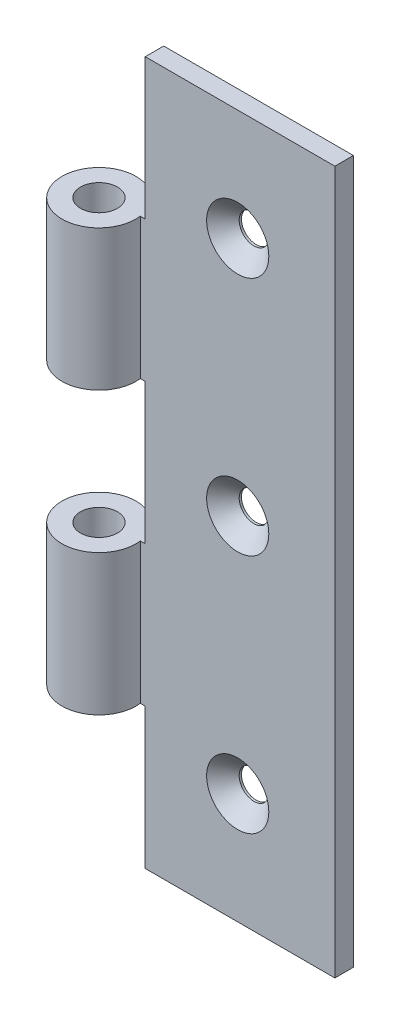
ISO-10303-21;
HEADER;
FILE_DESCRIPTION(('STEP AP214'),'2;1');
FILE_NAME('part.step','',(''),(''),'','','');
FILE_SCHEMA(('AUTOMOTIVE_DESIGN { 1 0 10303 214 1 1 1 1 }'));
ENDSEC;
DATA;
#1=APPLICATION_CONTEXT('core data for automotive mechanical design processes');
#2=APPLICATION_PROTOCOL_DEFINITION('international standard','automotive_design',2000,#1);
#3=PRODUCT_CONTEXT('',#1,'mechanical');
#4=PRODUCT('Part','Part','',(#3));
#5=PRODUCT_RELATED_PRODUCT_CATEGORY('part','',(#4));
#6=PRODUCT_DEFINITION_FORMATION('','',#4);
#7=PRODUCT_DEFINITION_CONTEXT('part definition',#1,'design');
#8=PRODUCT_DEFINITION('design','',#6,#7);
#9=PRODUCT_DEFINITION_SHAPE('','',#8);
#10=(LENGTH_UNIT() NAMED_UNIT(*) SI_UNIT(.MILLI.,.METRE.));
#11=(NAMED_UNIT(*) PLANE_ANGLE_UNIT() SI_UNIT($,.RADIAN.));
#12=(NAMED_UNIT(*) SI_UNIT($,.STERADIAN.) SOLID_ANGLE_UNIT());
#13=UNCERTAINTY_MEASURE_WITH_UNIT(LENGTH_MEASURE(1.E-05),#10,'distance_accuracy_value','');
#14=(GEOMETRIC_REPRESENTATION_CONTEXT(3) GLOBAL_UNCERTAINTY_ASSIGNED_CONTEXT((#13)) GLOBAL_UNIT_ASSIGNED_CONTEXT((#10,
#11,#12)) REPRESENTATION_CONTEXT('',''));
#15=CARTESIAN_POINT('',(0.,0.,0.));
#16=DIRECTION('',(0.,0.,1.));
#17=DIRECTION('',(1.,0.,0.));
#18=AXIS2_PLACEMENT_3D('',#15,#16,#17);
#19=CARTESIAN_POINT('',(14.0612494995996,76.,-2.5));
#20=DIRECTION('',(0.,0.,1.));
#21=DIRECTION('',(1.,0.,0.));
#22=AXIS2_PLACEMENT_3D('',#19,#20,#21);
#23=PLANE('',#22);
#24=CARTESIAN_POINT('',(14.5,12.,-2.5));
#25=DIRECTION('',(0.,0.,1.));
#26=DIRECTION('',(-1.,0.,0.));
#27=AXIS2_PLACEMENT_3D('',#24,#25,#26);
#28=CIRCLE('',#27,1.6);
#29=CARTESIAN_POINT('',(12.9,12.,-2.5));
#30=VERTEX_POINT('',#29);
#31=EDGE_CURVE('E11',#30,#30,#28,.T.);
#32=ORIENTED_EDGE('',*,*,#31,.T.);
#33=EDGE_LOOP('',(#32));
#34=FACE_BOUND('',#33,.T.);
#35=CARTESIAN_POINT('',(14.5,38.,-2.5));
#36=DIRECTION('',(0.,0.,1.));
#37=DIRECTION('',(-1.,0.,0.));
#38=AXIS2_PLACEMENT_3D('',#35,#36,#37);
#39=CIRCLE('',#38,1.6);
#40=CARTESIAN_POINT('',(12.9,38.,-2.5));
#41=VERTEX_POINT('',#40);
#42=EDGE_CURVE('E28',#41,#41,#39,.T.);
#43=ORIENTED_EDGE('',*,*,#42,.T.);
#44=EDGE_LOOP('',(#43));
#45=FACE_BOUND('',#44,.T.);
#46=CARTESIAN_POINT('',(14.5,64.,-2.5));
#47=DIRECTION('',(0.,0.,1.));
#48=DIRECTION('',(-1.,0.,0.));
#49=AXIS2_PLACEMENT_3D('',#46,#47,#48);
#50=CIRCLE('',#49,1.6);
#51=CARTESIAN_POINT('',(12.9,64.,-2.5));
#52=VERTEX_POINT('',#51);
#53=EDGE_CURVE('E244',#52,#52,#50,.T.);
#54=ORIENTED_EDGE('',*,*,#53,.T.);
#55=EDGE_LOOP('',(#54));
#56=FACE_BOUND('',#55,.T.);
#57=DIRECTION('',(1.,0.,0.));
#58=VECTOR('',#57,1.);
#59=CARTESIAN_POINT('',(14.0612494995996,15.2,-2.5));
#60=LINE('',#59,#58);
#61=CARTESIAN_POINT('',(3.12249899919921,15.2,-2.5));
#62=VERTEX_POINT('',#61);
#63=CARTESIAN_POINT('',(4.5,15.2,-2.5));
#64=VERTEX_POINT('',#63);
#65=EDGE_CURVE('E314',#62,#64,#60,.T.);
#66=ORIENTED_EDGE('',*,*,#65,.F.);
#67=DIRECTION('',(0.,-1.,0.));
#68=VECTOR('',#67,1.);
#69=CARTESIAN_POINT('',(3.1224989991992,76.,-2.5));
#70=LINE('',#69,#68);
#71=CARTESIAN_POINT('',(3.12249899919921,30.4,-2.5));
#72=VERTEX_POINT('',#71);
#73=EDGE_CURVE('E333',#72,#62,#70,.T.);
#74=ORIENTED_EDGE('',*,*,#73,.F.);
#75=DIRECTION('',(1.,0.,0.));
#76=VECTOR('',#75,1.);
#77=CARTESIAN_POINT('',(14.0612494995996,30.4,-2.5));
#78=LINE('',#77,#76);
#79=CARTESIAN_POINT('',(4.5,30.4,-2.5));
#80=VERTEX_POINT('',#79);
#81=EDGE_CURVE('E241',#72,#80,#78,.T.);
#82=ORIENTED_EDGE('',*,*,#81,.T.);
#83=DIRECTION('',(0.,-1.,0.));
#84=VECTOR('',#83,1.);
#85=CARTESIAN_POINT('',(4.5,76.,-2.5));
#86=LINE('',#85,#84);
#87=CARTESIAN_POINT('',(4.5,45.6,-2.5));
#88=VERTEX_POINT('',#87);
#89=EDGE_CURVE('E270',#88,#80,#86,.T.);
#90=ORIENTED_EDGE('',*,*,#89,.F.);
#91=DIRECTION('',(1.,0.,0.));
#92=VECTOR('',#91,1.);
#93=CARTESIAN_POINT('',(14.0612494995996,45.6,-2.5));
#94=LINE('',#93,#92);
#95=CARTESIAN_POINT('',(3.12249899919921,45.6,-2.5));
#96=VERTEX_POINT('',#95);
#97=EDGE_CURVE('E274',#96,#88,#94,.T.);
#98=ORIENTED_EDGE('',*,*,#97,.F.);
#99=DIRECTION('',(0.,-1.,0.));
#100=VECTOR('',#99,1.);
#101=CARTESIAN_POINT('',(3.1224989991992,76.,-2.5));
#102=LINE('',#101,#100);
#103=CARTESIAN_POINT('',(3.12249899919921,60.8,-2.5));
#104=VERTEX_POINT('',#103);
#105=EDGE_CURVE('E343',#104,#96,#102,.T.);
#106=ORIENTED_EDGE('',*,*,#105,.F.);
#107=DIRECTION('',(1.,0.,0.));
#108=VECTOR('',#107,1.);
#109=CARTESIAN_POINT('',(14.0612494995996,60.8,-2.5));
#110=LINE('',#109,#108);
#111=CARTESIAN_POINT('',(4.5,60.8,-2.5));
#112=VERTEX_POINT('',#111);
#113=EDGE_CURVE('E245',#104,#112,#110,.T.);
#114=ORIENTED_EDGE('',*,*,#113,.T.);
#115=DIRECTION('',(0.,-1.,0.));
#116=VECTOR('',#115,1.);
#117=CARTESIAN_POINT('',(4.5,76.,-2.5));
#118=LINE('',#117,#116);
#119=CARTESIAN_POINT('',(4.5,76.,-2.5));
#120=VERTEX_POINT('',#119);
#121=EDGE_CURVE('E265',#120,#112,#118,.T.);
#122=ORIENTED_EDGE('',*,*,#121,.F.);
#123=DIRECTION('',(1.,0.,0.));
#124=VECTOR('',#123,1.);
#125=CARTESIAN_POINT('',(14.0612494995996,76.,-2.5));
#126=LINE('',#125,#124);
#127=CARTESIAN_POINT('',(25.,76.,-2.5));
#128=VERTEX_POINT('',#127);
#129=EDGE_CURVE('E249',#120,#128,#126,.T.);
#130=ORIENTED_EDGE('',*,*,#129,.T.);
#131=DIRECTION('',(0.,-1.,0.));
#132=VECTOR('',#131,1.);
#133=CARTESIAN_POINT('',(25.,76.,-2.5));
#134=LINE('',#133,#132);
#135=CARTESIAN_POINT('',(25.,0.,-2.5));
#136=VERTEX_POINT('',#135);
#137=EDGE_CURVE('E227',#128,#136,#134,.T.);
#138=ORIENTED_EDGE('',*,*,#137,.T.);
#139=DIRECTION('',(1.,0.,0.));
#140=VECTOR('',#139,1.);
#141=CARTESIAN_POINT('',(14.0612494995996,0.,-2.5));
#142=LINE('',#141,#140);
#143=CARTESIAN_POINT('',(4.5,0.,-2.5));
#144=VERTEX_POINT('',#143);
#145=EDGE_CURVE('E230',#144,#136,#142,.T.);
#146=ORIENTED_EDGE('',*,*,#145,.F.);
#147=DIRECTION('',(0.,-1.,0.));
#148=VECTOR('',#147,1.);
#149=CARTESIAN_POINT('',(4.5,76.,-2.5));
#150=LINE('',#149,#148);
#151=EDGE_CURVE('E347',#64,#144,#150,.T.);
#152=ORIENTED_EDGE('',*,*,#151,.F.);
#153=EDGE_LOOP('',(#66,#74,#82,#90,#98,#106,#114,#122,#130,#138,#146,#152));
#154=FACE_BOUND('',#153,.T.);
#155=ADVANCED_FACE('F17',(#34,#45,#56,#154),#23,.F.);
#156=CARTESIAN_POINT('',(0.,76.,0.));
#157=DIRECTION('',(0.,-1.,0.));
#158=DIRECTION('',(0.,0.,-1.));
#159=AXIS2_PLACEMENT_3D('',#156,#157,#158);
#160=CYLINDRICAL_SURFACE('',#159,4.);
#161=ORIENTED_EDGE('',*,*,#73,.T.);
#162=CARTESIAN_POINT('',(0.,15.2,0.));
#163=DIRECTION('',(0.,1.,0.));
#164=DIRECTION('',(0.,0.,-1.));
#165=AXIS2_PLACEMENT_3D('',#162,#163,#164);
#166=CIRCLE('',#165,4.);
#167=CARTESIAN_POINT('',(3.96862696659689,15.2,-0.5));
#168=VERTEX_POINT('',#167);
#169=EDGE_CURVE('E340',#62,#168,#166,.T.);
#170=ORIENTED_EDGE('',*,*,#169,.T.);
#171=DIRECTION('',(0.,-1.,0.));
#172=VECTOR('',#171,1.);
#173=CARTESIAN_POINT('',(3.96862696659689,76.,-0.5));
#174=LINE('',#173,#172);
#175=CARTESIAN_POINT('',(3.96862696659689,30.4,-0.5));
#176=VERTEX_POINT('',#175);
#177=EDGE_CURVE('E281',#176,#168,#174,.T.);
#178=ORIENTED_EDGE('',*,*,#177,.F.);
#179=CARTESIAN_POINT('',(0.,30.4,0.));
#180=DIRECTION('',(0.,1.,0.));
#181=DIRECTION('',(0.,0.,-1.));
#182=AXIS2_PLACEMENT_3D('',#179,#180,#181);
#183=CIRCLE('',#182,4.);
#184=EDGE_CURVE('E296',#72,#176,#183,.T.);
#185=ORIENTED_EDGE('',*,*,#184,.F.);
#186=EDGE_LOOP('',(#161,#170,#178,#185));
#187=FACE_BOUND('',#186,.T.);
#188=ADVANCED_FACE('F382',(#187),#160,.T.);
#189=CARTESIAN_POINT('',(0.,76.,0.));
#190=DIRECTION('',(0.,-1.,0.));
#191=DIRECTION('',(0.,0.,-1.));
#192=AXIS2_PLACEMENT_3D('',#189,#190,#191);
#193=CYLINDRICAL_SURFACE('',#192,4.);
#194=ORIENTED_EDGE('',*,*,#105,.T.);
#195=CARTESIAN_POINT('',(0.,45.6,0.));
#196=DIRECTION('',(0.,1.,0.));
#197=DIRECTION('',(0.,0.,-1.));
#198=AXIS2_PLACEMENT_3D('',#195,#196,#197);
#199=CIRCLE('',#198,4.);
#200=CARTESIAN_POINT('',(3.96862696659689,45.6,-0.5));
#201=VERTEX_POINT('',#200);
#202=EDGE_CURVE('E284',#96,#201,#199,.T.);
#203=ORIENTED_EDGE('',*,*,#202,.T.);
#204=DIRECTION('',(0.,-1.,0.));
#205=VECTOR('',#204,1.);
#206=CARTESIAN_POINT('',(3.96862696659689,76.,-0.5));
#207=LINE('',#206,#205);
#208=CARTESIAN_POINT('',(3.96862696659689,60.8,-0.5));
#209=VERTEX_POINT('',#208);
#210=EDGE_CURVE('E239',#209,#201,#207,.T.);
#211=ORIENTED_EDGE('',*,*,#210,.F.);
#212=CARTESIAN_POINT('',(0.,60.8,0.));
#213=DIRECTION('',(0.,1.,0.));
#214=DIRECTION('',(0.,0.,-1.));
#215=AXIS2_PLACEMENT_3D('',#212,#213,#214);
#216=CIRCLE('',#215,4.);
#217=EDGE_CURVE('E264',#104,#209,#216,.T.);
#218=ORIENTED_EDGE('',*,*,#217,.F.);
#219=EDGE_LOOP('',(#194,#203,#211,#218));
#220=FACE_BOUND('',#219,.T.);
#221=ADVANCED_FACE('F419',(#220),#193,.T.);
#222=CARTESIAN_POINT('',(14.4843134832984,76.,-0.5));
#223=DIRECTION('',(0.,0.,1.));
#224=DIRECTION('',(1.,0.,0.));
#225=AXIS2_PLACEMENT_3D('',#222,#223,#224);
#226=PLANE('',#225);
#227=CARTESIAN_POINT('',(14.5,64.,-0.5));
#228=DIRECTION('',(0.,0.,1.));
#229=DIRECTION('',(1.,0.,0.));
#230=AXIS2_PLACEMENT_3D('',#227,#228,#229);
#231=CIRCLE('',#230,3.36);
#232=CARTESIAN_POINT('',(17.86,64.,-0.5));
#233=VERTEX_POINT('',#232);
#234=EDGE_CURVE('E290',#233,#233,#231,.T.);
#235=ORIENTED_EDGE('',*,*,#234,.F.);
#236=EDGE_LOOP('',(#235));
#237=FACE_BOUND('',#236,.T.);
#238=CARTESIAN_POINT('',(14.5,38.,-0.5));
#239=DIRECTION('',(0.,0.,1.));
#240=DIRECTION('',(1.,0.,0.));
#241=AXIS2_PLACEMENT_3D('',#238,#239,#240);
#242=CIRCLE('',#241,3.36);
#243=CARTESIAN_POINT('',(17.86,38.,-0.5));
#244=VERTEX_POINT('',#243);
#245=EDGE_CURVE('E279',#244,#244,#242,.T.);
#246=ORIENTED_EDGE('',*,*,#245,.F.);
#247=EDGE_LOOP('',(#246));
#248=FACE_BOUND('',#247,.T.);
#249=CARTESIAN_POINT('',(14.5,12.,-0.5));
#250=DIRECTION('',(0.,0.,1.));
#251=DIRECTION('',(1.,0.,0.));
#252=AXIS2_PLACEMENT_3D('',#249,#250,#251);
#253=CIRCLE('',#252,3.36);
#254=CARTESIAN_POINT('',(17.86,12.,-0.5));
#255=VERTEX_POINT('',#254);
#256=EDGE_CURVE('E250',#255,#255,#253,.T.);
#257=ORIENTED_EDGE('',*,*,#256,.F.);
#258=EDGE_LOOP('',(#257));
#259=FACE_BOUND('',#258,.T.);
#260=ORIENTED_EDGE('',*,*,#177,.T.);
#261=DIRECTION('',(1.,0.,0.));
#262=VECTOR('',#261,1.);
#263=CARTESIAN_POINT('',(14.4843134832984,15.2,-0.5));
#264=LINE('',#263,#262);
#265=CARTESIAN_POINT('',(4.5,15.2,-0.5));
#266=VERTEX_POINT('',#265);
#267=EDGE_CURVE('E285',#168,#266,#264,.T.);
#268=ORIENTED_EDGE('',*,*,#267,.T.);
#269=DIRECTION('',(0.,-1.,0.));
#270=VECTOR('',#269,1.);
#271=CARTESIAN_POINT('',(4.5,76.,-0.5));
#272=LINE('',#271,#270);
#273=CARTESIAN_POINT('',(4.5,0.,-0.5));
#274=VERTEX_POINT('',#273);
#275=EDGE_CURVE('E334',#266,#274,#272,.T.);
#276=ORIENTED_EDGE('',*,*,#275,.T.);
#277=DIRECTION('',(1.,0.,0.));
#278=VECTOR('',#277,1.);
#279=CARTESIAN_POINT('',(14.4843134832984,0.,-0.5));
#280=LINE('',#279,#278);
#281=CARTESIAN_POINT('',(25.,0.,-0.5));
#282=VERTEX_POINT('',#281);
#283=EDGE_CURVE('E218',#274,#282,#280,.T.);
#284=ORIENTED_EDGE('',*,*,#283,.T.);
#285=DIRECTION('',(0.,-1.,0.));
#286=VECTOR('',#285,1.);
#287=CARTESIAN_POINT('',(25.,76.,-0.5));
#288=LINE('',#287,#286);
#289=CARTESIAN_POINT('',(25.,76.,-0.5));
#290=VERTEX_POINT('',#289);
#291=EDGE_CURVE('E214',#290,#282,#288,.T.);
#292=ORIENTED_EDGE('',*,*,#291,.F.);
#293=DIRECTION('',(1.,0.,0.));
#294=VECTOR('',#293,1.);
#295=CARTESIAN_POINT('',(14.4843134832984,76.,-0.5));
#296=LINE('',#295,#294);
#297=CARTESIAN_POINT('',(4.5,76.,-0.5));
#298=VERTEX_POINT('',#297);
#299=EDGE_CURVE('E201',#298,#290,#296,.T.);
#300=ORIENTED_EDGE('',*,*,#299,.F.);
#301=DIRECTION('',(0.,-1.,0.));
#302=VECTOR('',#301,1.);
#303=CARTESIAN_POINT('',(4.5,76.,-0.5));
#304=LINE('',#303,#302);
#305=CARTESIAN_POINT('',(4.5,60.8,-0.5));
#306=VERTEX_POINT('',#305);
#307=EDGE_CURVE('E254',#298,#306,#304,.T.);
#308=ORIENTED_EDGE('',*,*,#307,.T.);
#309=DIRECTION('',(1.,0.,0.));
#310=VECTOR('',#309,1.);
#311=CARTESIAN_POINT('',(14.4843134832984,60.8,-0.5));
#312=LINE('',#311,#310);
#313=EDGE_CURVE('E92',#209,#306,#312,.T.);
#314=ORIENTED_EDGE('',*,*,#313,.F.);
#315=ORIENTED_EDGE('',*,*,#210,.T.);
#316=DIRECTION('',(1.,0.,0.));
#317=VECTOR('',#316,1.);
#318=CARTESIAN_POINT('',(14.4843134832984,45.6,-0.5));
#319=LINE('',#318,#317);
#320=CARTESIAN_POINT('',(4.5,45.6,-0.5));
#321=VERTEX_POINT('',#320);
#322=EDGE_CURVE('E273',#201,#321,#319,.T.);
#323=ORIENTED_EDGE('',*,*,#322,.T.);
#324=DIRECTION('',(0.,-1.,0.));
#325=VECTOR('',#324,1.);
#326=CARTESIAN_POINT('',(4.5,76.,-0.5));
#327=LINE('',#326,#325);
#328=CARTESIAN_POINT('',(4.5,30.4,-0.5));
#329=VERTEX_POINT('',#328);
#330=EDGE_CURVE('E109',#321,#329,#327,.T.);
#331=ORIENTED_EDGE('',*,*,#330,.T.);
#332=DIRECTION('',(1.,0.,0.));
#333=VECTOR('',#332,1.);
#334=CARTESIAN_POINT('',(14.4843134832984,30.4,-0.5));
#335=LINE('',#334,#333);
#336=EDGE_CURVE('E320',#176,#329,#335,.T.);
#337=ORIENTED_EDGE('',*,*,#336,.F.);
#338=EDGE_LOOP('',(#260,#268,#276,#284,#292,#300,#308,#314,#315,#323,#331,#337));
#339=FACE_BOUND('',#338,.T.);
#340=ADVANCED_FACE('F216',(#237,#248,#259,#339),#226,.T.);
#341=CARTESIAN_POINT('',(25.,76.,-1.5));
#342=DIRECTION('',(1.,0.,0.));
#343=DIRECTION('',(0.,1.,0.));
#344=AXIS2_PLACEMENT_3D('',#341,#342,#343);
#345=PLANE('',#344);
#346=DIRECTION('',(0.,0.,-1.));
#347=VECTOR('',#346,1.);
#348=CARTESIAN_POINT('',(25.,0.,-1.5));
#349=LINE('',#348,#347);
#350=EDGE_CURVE('E223',#282,#136,#349,.T.);
#351=ORIENTED_EDGE('',*,*,#350,.T.);
#352=ORIENTED_EDGE('',*,*,#137,.F.);
#353=DIRECTION('',(0.,0.,-1.));
#354=VECTOR('',#353,1.);
#355=CARTESIAN_POINT('',(25.,76.,-1.5));
#356=LINE('',#355,#354);
#357=EDGE_CURVE('E206',#290,#128,#356,.T.);
#358=ORIENTED_EDGE('',*,*,#357,.F.);
#359=ORIENTED_EDGE('',*,*,#291,.T.);
#360=EDGE_LOOP('',(#351,#352,#358,#359));
#361=FACE_BOUND('',#360,.T.);
#362=ADVANCED_FACE('F225',(#361),#345,.T.);
#363=CARTESIAN_POINT('',(10.5,76.,0.));
#364=DIRECTION('',(0.,-1.,0.));
#365=DIRECTION('',(0.,0.,-1.));
#366=AXIS2_PLACEMENT_3D('',#363,#364,#365);
#367=PLANE('',#366);
#368=ORIENTED_EDGE('',*,*,#129,.F.);
#369=DIRECTION('',(0.,0.,1.));
#370=VECTOR('',#369,1.);
#371=CARTESIAN_POINT('',(4.5,76.,-91.333600454647));
#372=LINE('',#371,#370);
#373=EDGE_CURVE('E208',#120,#298,#372,.T.);
#374=ORIENTED_EDGE('',*,*,#373,.T.);
#375=ORIENTED_EDGE('',*,*,#299,.T.);
#376=ORIENTED_EDGE('',*,*,#357,.T.);
#377=EDGE_LOOP('',(#368,#374,#375,#376));
#378=FACE_BOUND('',#377,.T.);
#379=ADVANCED_FACE('F204',(#378),#367,.F.);
#380=CARTESIAN_POINT('',(10.5,0.,0.));
#381=DIRECTION('',(0.,-1.,0.));
#382=DIRECTION('',(0.,0.,-1.));
#383=AXIS2_PLACEMENT_3D('',#380,#381,#382);
#384=PLANE('',#383);
#385=DIRECTION('',(0.,0.,1.));
#386=VECTOR('',#385,1.);
#387=CARTESIAN_POINT('',(4.5,0.,-91.333600454647));
#388=LINE('',#387,#386);
#389=EDGE_CURVE('E261',#144,#274,#388,.T.);
#390=ORIENTED_EDGE('',*,*,#389,.F.);
#391=ORIENTED_EDGE('',*,*,#145,.T.);
#392=ORIENTED_EDGE('',*,*,#350,.F.);
#393=ORIENTED_EDGE('',*,*,#283,.F.);
#394=EDGE_LOOP('',(#390,#391,#392,#393));
#395=FACE_BOUND('',#394,.T.);
#396=ADVANCED_FACE('F432',(#395),#384,.T.);
#397=CARTESIAN_POINT('',(14.5,12.,-0.5));
#398=DIRECTION('',(0.,0.,-1.));
#399=DIRECTION('',(1.,0.,0.));
#400=AXIS2_PLACEMENT_3D('',#397,#398,#399);
#401=CYLINDRICAL_SURFACE('',#400,1.6);
#402=CARTESIAN_POINT('',(14.5,12.,-2.26));
#403=DIRECTION('',(0.,0.,1.));
#404=DIRECTION('',(1.,0.,0.));
#405=AXIS2_PLACEMENT_3D('',#402,#403,#404);
#406=CIRCLE('',#405,1.6);
#407=CARTESIAN_POINT('',(16.1,12.,-2.26));
#408=VERTEX_POINT('',#407);
#409=EDGE_CURVE('E122',#408,#408,#406,.T.);
#410=ORIENTED_EDGE('',*,*,#409,.T.);
#411=EDGE_LOOP('',(#410));
#412=FACE_BOUND('',#411,.T.);
#413=ORIENTED_EDGE('',*,*,#31,.F.);
#414=EDGE_LOOP('',(#413));
#415=FACE_BOUND('',#414,.T.);
#416=ADVANCED_FACE('F410',(#412,#415),#401,.F.);
#417=CARTESIAN_POINT('',(14.5,12.,-0.5));
#418=DIRECTION('',(0.,0.,1.));
#419=DIRECTION('',(-1.,0.,0.));
#420=AXIS2_PLACEMENT_3D('',#417,#418,#419);
#421=CONICAL_SURFACE('',#420,3.36,0.785398163397448);
#422=ORIENTED_EDGE('',*,*,#409,.F.);
#423=EDGE_LOOP('',(#422));
#424=FACE_BOUND('',#423,.T.);
#425=ORIENTED_EDGE('',*,*,#256,.T.);
#426=EDGE_LOOP('',(#425));
#427=FACE_BOUND('',#426,.T.);
#428=ADVANCED_FACE('F401',(#424,#427),#421,.F.);
#429=CARTESIAN_POINT('',(14.5,38.,-0.5));
#430=DIRECTION('',(0.,0.,-1.));
#431=DIRECTION('',(1.,0.,0.));
#432=AXIS2_PLACEMENT_3D('',#429,#430,#431);
#433=CYLINDRICAL_SURFACE('',#432,1.6);
#434=CARTESIAN_POINT('',(14.5,38.,-2.26));
#435=DIRECTION('',(0.,0.,1.));
#436=DIRECTION('',(1.,0.,0.));
#437=AXIS2_PLACEMENT_3D('',#434,#435,#436);
#438=CIRCLE('',#437,1.6);
#439=CARTESIAN_POINT('',(16.1,38.,-2.26));
#440=VERTEX_POINT('',#439);
#441=EDGE_CURVE('E132',#440,#440,#438,.T.);
#442=ORIENTED_EDGE('',*,*,#441,.T.);
#443=EDGE_LOOP('',(#442));
#444=FACE_BOUND('',#443,.T.);
#445=ORIENTED_EDGE('',*,*,#42,.F.);
#446=EDGE_LOOP('',(#445));
#447=FACE_BOUND('',#446,.T.);
#448=ADVANCED_FACE('F398',(#444,#447),#433,.F.);
#449=CARTESIAN_POINT('',(14.5,38.,-0.5));
#450=DIRECTION('',(0.,0.,1.));
#451=DIRECTION('',(-1.,0.,0.));
#452=AXIS2_PLACEMENT_3D('',#449,#450,#451);
#453=CONICAL_SURFACE('',#452,3.36,0.785398163397448);
#454=ORIENTED_EDGE('',*,*,#441,.F.);
#455=EDGE_LOOP('',(#454));
#456=FACE_BOUND('',#455,.T.);
#457=ORIENTED_EDGE('',*,*,#245,.T.);
#458=EDGE_LOOP('',(#457));
#459=FACE_BOUND('',#458,.T.);
#460=ADVANCED_FACE('F400',(#456,#459),#453,.F.);
#461=CARTESIAN_POINT('',(14.5,64.,-0.5));
#462=DIRECTION('',(0.,0.,-1.));
#463=DIRECTION('',(1.,0.,0.));
#464=AXIS2_PLACEMENT_3D('',#461,#462,#463);
#465=CYLINDRICAL_SURFACE('',#464,1.6);
#466=CARTESIAN_POINT('',(14.5,64.,-2.26));
#467=DIRECTION('',(0.,0.,1.));
#468=DIRECTION('',(1.,0.,0.));
#469=AXIS2_PLACEMENT_3D('',#466,#467,#468);
#470=CIRCLE('',#469,1.6);
#471=CARTESIAN_POINT('',(16.1,64.,-2.26));
#472=VERTEX_POINT('',#471);
#473=EDGE_CURVE('E286',#472,#472,#470,.T.);
#474=ORIENTED_EDGE('',*,*,#473,.T.);
#475=EDGE_LOOP('',(#474));
#476=FACE_BOUND('',#475,.T.);
#477=ORIENTED_EDGE('',*,*,#53,.F.);
#478=EDGE_LOOP('',(#477));
#479=FACE_BOUND('',#478,.T.);
#480=ADVANCED_FACE('F19',(#476,#479),#465,.F.);
#481=CARTESIAN_POINT('',(14.5,64.,-0.5));
#482=DIRECTION('',(0.,0.,1.));
#483=DIRECTION('',(-1.,0.,0.));
#484=AXIS2_PLACEMENT_3D('',#481,#482,#483);
#485=CONICAL_SURFACE('',#484,3.36,0.785398163397448);
#486=ORIENTED_EDGE('',*,*,#473,.F.);
#487=EDGE_LOOP('',(#486));
#488=FACE_BOUND('',#487,.T.);
#489=ORIENTED_EDGE('',*,*,#234,.T.);
#490=EDGE_LOOP('',(#489));
#491=FACE_BOUND('',#490,.T.);
#492=ADVANCED_FACE('F433',(#488,#491),#485,.F.);
#493=CARTESIAN_POINT('',(0.,60.8,-91.333600454647));
#494=DIRECTION('',(0.,-1.,0.));
#495=DIRECTION('',(0.,0.,-1.));
#496=AXIS2_PLACEMENT_3D('',#493,#494,#495);
#497=PLANE('',#496);
#498=CARTESIAN_POINT('',(0.,60.8,0.));
#499=DIRECTION('',(0.,1.,0.));
#500=DIRECTION('',(0.,0.,-1.));
#501=AXIS2_PLACEMENT_3D('',#498,#499,#500);
#502=CIRCLE('',#501,2.);
#503=CARTESIAN_POINT('',(0.,60.8,-2.));
#504=VERTEX_POINT('',#503);
#505=EDGE_CURVE('E257',#504,#504,#502,.T.);
#506=ORIENTED_EDGE('',*,*,#505,.F.);
#507=EDGE_LOOP('',(#506));
#508=FACE_BOUND('',#507,.T.);
#509=ORIENTED_EDGE('',*,*,#217,.T.);
#510=ORIENTED_EDGE('',*,*,#313,.T.);
#511=DIRECTION('',(0.,0.,1.));
#512=VECTOR('',#511,1.);
#513=CARTESIAN_POINT('',(4.5,60.8,-91.333600454647));
#514=LINE('',#513,#512);
#515=EDGE_CURVE('E266',#112,#306,#514,.T.);
#516=ORIENTED_EDGE('',*,*,#515,.F.);
#517=ORIENTED_EDGE('',*,*,#113,.F.);
#518=EDGE_LOOP('',(#509,#510,#516,#517));
#519=FACE_BOUND('',#518,.T.);
#520=ADVANCED_FACE('F436',(#508,#519),#497,.F.);
#521=CARTESIAN_POINT('',(4.5,68.4,-91.333600454647));
#522=DIRECTION('',(-1.,0.,0.));
#523=DIRECTION('',(0.,1.,0.));
#524=AXIS2_PLACEMENT_3D('',#521,#522,#523);
#525=PLANE('',#524);
#526=ORIENTED_EDGE('',*,*,#121,.T.);
#527=ORIENTED_EDGE('',*,*,#515,.T.);
#528=ORIENTED_EDGE('',*,*,#307,.F.);
#529=ORIENTED_EDGE('',*,*,#373,.F.);
#530=EDGE_LOOP('',(#526,#527,#528,#529));
#531=FACE_BOUND('',#530,.T.);
#532=ADVANCED_FACE('F438',(#531),#525,.T.);
#533=CARTESIAN_POINT('',(4.5,38.,-91.333600454647));
#534=DIRECTION('',(-1.,0.,0.));
#535=DIRECTION('',(0.,1.,0.));
#536=AXIS2_PLACEMENT_3D('',#533,#534,#535);
#537=PLANE('',#536);
#538=ORIENTED_EDGE('',*,*,#89,.T.);
#539=DIRECTION('',(0.,0.,1.));
#540=VECTOR('',#539,1.);
#541=CARTESIAN_POINT('',(4.5,30.4,-91.333600454647));
#542=LINE('',#541,#540);
#543=EDGE_CURVE('E293',#80,#329,#542,.T.);
#544=ORIENTED_EDGE('',*,*,#543,.T.);
#545=ORIENTED_EDGE('',*,*,#330,.F.);
#546=DIRECTION('',(0.,0.,1.));
#547=VECTOR('',#546,1.);
#548=CARTESIAN_POINT('',(4.5,45.6,-91.333600454647));
#549=LINE('',#548,#547);
#550=EDGE_CURVE('E277',#88,#321,#549,.T.);
#551=ORIENTED_EDGE('',*,*,#550,.F.);
#552=EDGE_LOOP('',(#538,#544,#545,#551));
#553=FACE_BOUND('',#552,.T.);
#554=ADVANCED_FACE('F441',(#553),#537,.T.);
#555=CARTESIAN_POINT('',(0.,30.4,-91.333600454647));
#556=DIRECTION('',(0.,-1.,0.));
#557=DIRECTION('',(0.,0.,-1.));
#558=AXIS2_PLACEMENT_3D('',#555,#556,#557);
#559=PLANE('',#558);
#560=CARTESIAN_POINT('',(0.,30.4,0.));
#561=DIRECTION('',(0.,1.,0.));
#562=DIRECTION('',(0.,0.,-1.));
#563=AXIS2_PLACEMENT_3D('',#560,#561,#562);
#564=CIRCLE('',#563,2.);
#565=CARTESIAN_POINT('',(0.,30.4,-2.));
#566=VERTEX_POINT('',#565);
#567=EDGE_CURVE('E299',#566,#566,#564,.T.);
#568=ORIENTED_EDGE('',*,*,#567,.F.);
#569=EDGE_LOOP('',(#568));
#570=FACE_BOUND('',#569,.T.);
#571=ORIENTED_EDGE('',*,*,#184,.T.);
#572=ORIENTED_EDGE('',*,*,#336,.T.);
#573=ORIENTED_EDGE('',*,*,#543,.F.);
#574=ORIENTED_EDGE('',*,*,#81,.F.);
#575=EDGE_LOOP('',(#571,#572,#573,#574));
#576=FACE_BOUND('',#575,.T.);
#577=ADVANCED_FACE('F448',(#570,#576),#559,.F.);
#578=CARTESIAN_POINT('',(0.,45.6,-91.333600454647));
#579=DIRECTION('',(0.,-1.,0.));
#580=DIRECTION('',(0.,0.,-1.));
#581=AXIS2_PLACEMENT_3D('',#578,#579,#580);
#582=PLANE('',#581);
#583=CARTESIAN_POINT('',(0.,45.6,0.));
#584=DIRECTION('',(0.,1.,0.));
#585=DIRECTION('',(0.,0.,-1.));
#586=AXIS2_PLACEMENT_3D('',#583,#584,#585);
#587=CIRCLE('',#586,2.);
#588=CARTESIAN_POINT('',(0.,45.6,-2.));
#589=VERTEX_POINT('',#588);
#590=EDGE_CURVE('E21',#589,#589,#587,.T.);
#591=ORIENTED_EDGE('',*,*,#590,.T.);
#592=EDGE_LOOP('',(#591));
#593=FACE_BOUND('',#592,.T.);
#594=ORIENTED_EDGE('',*,*,#97,.T.);
#595=ORIENTED_EDGE('',*,*,#550,.T.);
#596=ORIENTED_EDGE('',*,*,#322,.F.);
#597=ORIENTED_EDGE('',*,*,#202,.F.);
#598=EDGE_LOOP('',(#594,#595,#596,#597));
#599=FACE_BOUND('',#598,.T.);
#600=ADVANCED_FACE('F449',(#593,#599),#582,.T.);
#601=CARTESIAN_POINT('',(0.,76.,0.));
#602=DIRECTION('',(0.,-1.,0.));
#603=DIRECTION('',(0.,0.,-1.));
#604=AXIS2_PLACEMENT_3D('',#601,#602,#603);
#605=CYLINDRICAL_SURFACE('',#604,2.);
#606=ORIENTED_EDGE('',*,*,#567,.T.);
#607=EDGE_LOOP('',(#606));
#608=FACE_BOUND('',#607,.T.);
#609=CARTESIAN_POINT('',(0.,15.2,0.));
#610=DIRECTION('',(0.,1.,0.));
#611=DIRECTION('',(0.,0.,-1.));
#612=AXIS2_PLACEMENT_3D('',#609,#610,#611);
#613=CIRCLE('',#612,2.);
#614=CARTESIAN_POINT('',(0.,15.2,-2.));
#615=VERTEX_POINT('',#614);
#616=EDGE_CURVE('E317',#615,#615,#613,.T.);
#617=ORIENTED_EDGE('',*,*,#616,.F.);
#618=EDGE_LOOP('',(#617));
#619=FACE_BOUND('',#618,.T.);
#620=ADVANCED_FACE('F452',(#608,#619),#605,.F.);
#621=CARTESIAN_POINT('',(0.,15.2,-91.333600454647));
#622=DIRECTION('',(0.,-1.,0.));
#623=DIRECTION('',(0.,0.,-1.));
#624=AXIS2_PLACEMENT_3D('',#621,#622,#623);
#625=PLANE('',#624);
#626=ORIENTED_EDGE('',*,*,#616,.T.);
#627=EDGE_LOOP('',(#626));
#628=FACE_BOUND('',#627,.T.);
#629=ORIENTED_EDGE('',*,*,#65,.T.);
#630=DIRECTION('',(0.,0.,1.));
#631=VECTOR('',#630,1.);
#632=CARTESIAN_POINT('',(4.5,15.2,-91.333600454647));
#633=LINE('',#632,#631);
#634=EDGE_CURVE('E318',#64,#266,#633,.T.);
#635=ORIENTED_EDGE('',*,*,#634,.T.);
#636=ORIENTED_EDGE('',*,*,#267,.F.);
#637=ORIENTED_EDGE('',*,*,#169,.F.);
#638=EDGE_LOOP('',(#629,#635,#636,#637));
#639=FACE_BOUND('',#638,.T.);
#640=ADVANCED_FACE('F387',(#628,#639),#625,.T.);
#641=CARTESIAN_POINT('',(4.5,7.6,-91.333600454647));
#642=DIRECTION('',(-1.,0.,0.));
#643=DIRECTION('',(0.,1.,0.));
#644=AXIS2_PLACEMENT_3D('',#641,#642,#643);
#645=PLANE('',#644);
#646=ORIENTED_EDGE('',*,*,#151,.T.);
#647=ORIENTED_EDGE('',*,*,#389,.T.);
#648=ORIENTED_EDGE('',*,*,#275,.F.);
#649=ORIENTED_EDGE('',*,*,#634,.F.);
#650=EDGE_LOOP('',(#646,#647,#648,#649));
#651=FACE_BOUND('',#650,.T.);
#652=ADVANCED_FACE('F425',(#651),#645,.T.);
#653=CARTESIAN_POINT('',(0.,76.,0.));
#654=DIRECTION('',(0.,-1.,0.));
#655=DIRECTION('',(0.,0.,-1.));
#656=AXIS2_PLACEMENT_3D('',#653,#654,#655);
#657=CYLINDRICAL_SURFACE('',#656,2.);
#658=ORIENTED_EDGE('',*,*,#505,.T.);
#659=EDGE_LOOP('',(#658));
#660=FACE_BOUND('',#659,.T.);
#661=ORIENTED_EDGE('',*,*,#590,.F.);
#662=EDGE_LOOP('',(#661));
#663=FACE_BOUND('',#662,.T.);
#664=ADVANCED_FACE('F428',(#660,#663),#657,.F.);
#665=CLOSED_SHELL('',(#155,#188,#221,#340,#362,#379,#396,#416,#428,#448,#460,#480,#492,#520,
#532,#554,#577,#600,#620,#640,#652,#664));
#666=MANIFOLD_SOLID_BREP('B1',#665);
#667=ADVANCED_BREP_SHAPE_REPRESENTATION('',(#18,#666),#14);
#668=SHAPE_DEFINITION_REPRESENTATION(#9,#667);
ENDSEC;
END-ISO-10303-21;
